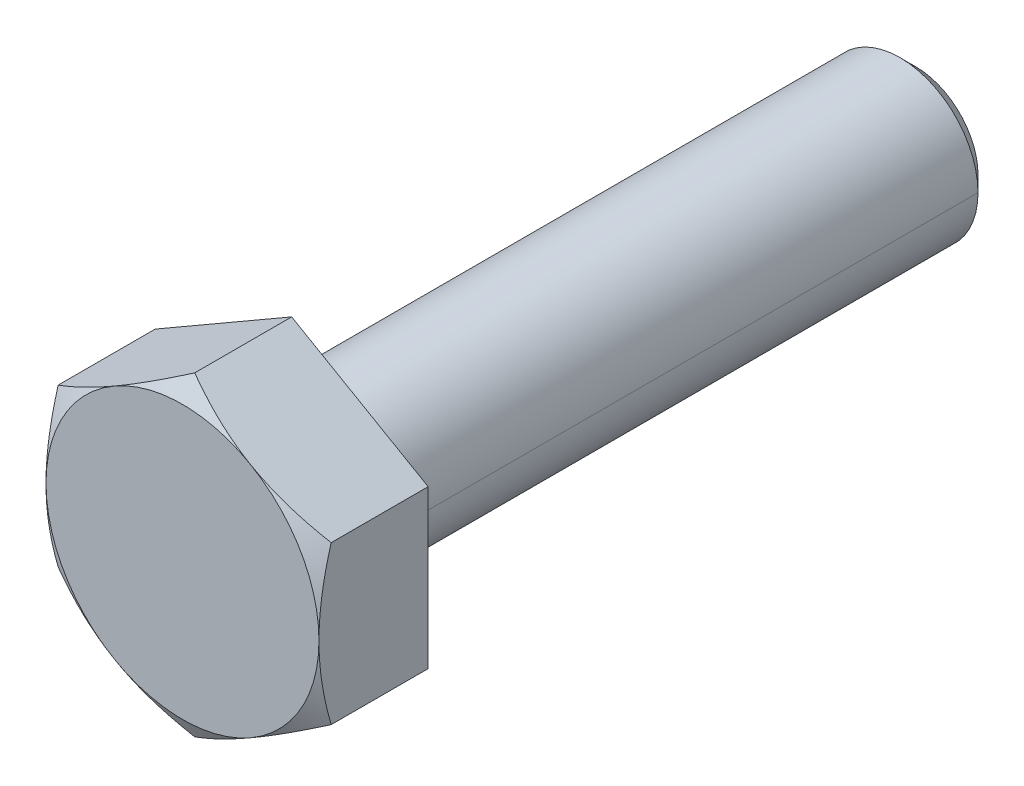
ISO-10303-21;
HEADER;
FILE_DESCRIPTION(('STEP AP214'),'2;1');
FILE_NAME('part.step','',(''),(''),'','','');
FILE_SCHEMA(('AUTOMOTIVE_DESIGN { 1 0 10303 214 1 1 1 1 }'));
ENDSEC;
DATA;
#1=APPLICATION_CONTEXT('core data for automotive mechanical design processes');
#2=APPLICATION_PROTOCOL_DEFINITION('international standard','automotive_design',2000,#1);
#3=PRODUCT_CONTEXT('',#1,'mechanical');
#4=PRODUCT('Part','Part','',(#3));
#5=PRODUCT_RELATED_PRODUCT_CATEGORY('part','',(#4));
#6=PRODUCT_DEFINITION_FORMATION('','',#4);
#7=PRODUCT_DEFINITION_CONTEXT('part definition',#1,'design');
#8=PRODUCT_DEFINITION('design','',#6,#7);
#9=PRODUCT_DEFINITION_SHAPE('','',#8);
#10=(LENGTH_UNIT() NAMED_UNIT(*) SI_UNIT(.MILLI.,.METRE.));
#11=(NAMED_UNIT(*) PLANE_ANGLE_UNIT() SI_UNIT($,.RADIAN.));
#12=(NAMED_UNIT(*) SI_UNIT($,.STERADIAN.) SOLID_ANGLE_UNIT());
#13=UNCERTAINTY_MEASURE_WITH_UNIT(LENGTH_MEASURE(1.E-05),#10,'distance_accuracy_value','');
#14=(GEOMETRIC_REPRESENTATION_CONTEXT(3) GLOBAL_UNCERTAINTY_ASSIGNED_CONTEXT((#13)) GLOBAL_UNIT_ASSIGNED_CONTEXT((#10,
#11,#12)) REPRESENTATION_CONTEXT('',''));
#15=CARTESIAN_POINT('',(0.,0.,0.));
#16=DIRECTION('',(0.,0.,1.));
#17=DIRECTION('',(1.,0.,0.));
#18=AXIS2_PLACEMENT_3D('',#15,#16,#17);
#19=CARTESIAN_POINT('',(-3.5,2.020725942164,16.));
#20=DIRECTION('',(-1.,0.,0.));
#21=DIRECTION('',(0.,0.,1.));
#22=AXIS2_PLACEMENT_3D('',#19,#20,#21);
#23=PLANE('',#22);
#24=DIRECTION('',(0.,0.,1.));
#25=VECTOR('',#24,1.);
#26=CARTESIAN_POINT('',(-3.5,2.020725942164,16.));
#27=LINE('',#26,#25);
#28=CARTESIAN_POINT('',(-3.5,2.020725942164,16.));
#29=VERTEX_POINT('',#28);
#30=CARTESIAN_POINT('',(-3.5,2.020725942164,18.48739260883));
#31=VERTEX_POINT('',#30);
#32=EDGE_CURVE('E153',#29,#31,#27,.T.);
#33=ORIENTED_EDGE('',*,*,#32,.F.);
#34=DIRECTION('',(0.,-1.,0.));
#35=VECTOR('',#34,1.);
#36=CARTESIAN_POINT('',(-3.5,2.020725942164,16.));
#37=LINE('',#36,#35);
#38=CARTESIAN_POINT('',(-3.5,-2.020725942164,16.));
#39=VERTEX_POINT('',#38);
#40=EDGE_CURVE('E161',#29,#39,#37,.T.);
#41=ORIENTED_EDGE('',*,*,#40,.T.);
#42=DIRECTION('',(0.,0.,1.));
#43=VECTOR('',#42,1.);
#44=CARTESIAN_POINT('',(-3.5,-2.020725942164,16.));
#45=LINE('',#44,#43);
#46=CARTESIAN_POINT('',(-3.5,-2.020725942164,18.48739260883));
#47=VERTEX_POINT('',#46);
#48=EDGE_CURVE('E10',#39,#47,#45,.T.);
#49=ORIENTED_EDGE('',*,*,#48,.T.);
#50=CARTESIAN_POINT('',(-3.500000000009,4.25789900067E-10,18.8));
#51=CARTESIAN_POINT('',(-3.500000000009,-0.1320789439768,18.8));
#52=CARTESIAN_POINT('',(-3.499999999996,-0.3964152682255,18.7913266907));
#53=CARTESIAN_POINT('',(-3.500000000001,-0.7925965413691,18.75285875718));
#54=CARTESIAN_POINT('',(-3.5,-1.191030931495,18.68995460997));
#55=CARTESIAN_POINT('',(-3.5,-1.596590700786,18.60321956078));
#56=CARTESIAN_POINT('',(-3.5,-1.877843824249,18.52863912345));
#57=CARTESIAN_POINT('',(-3.5,-2.020725942164,18.48739260883));
#58=(BOUNDED_CURVE() B_SPLINE_CURVE(3,(#50,#51,#52,#53,#54,#55,#56,#57),.UNSPECIFIED.,.F.,
.F.) B_SPLINE_CURVE_WITH_KNOTS((4,1,1,1,1,4),(0.,0.2,0.4,0.6,0.8,1.),
.UNSPECIFIED.) CURVE() GEOMETRIC_REPRESENTATION_ITEM() RATIONAL_B_SPLINE_CURVE((1.,1.,1.,1.,1.,
1.,1.,1.)) REPRESENTATION_ITEM(''));
#59=CARTESIAN_POINT('',(-3.5,5.062208430218E-10,18.8));
#60=VERTEX_POINT('',#59);
#61=EDGE_CURVE('E339',#60,#47,#58,.T.);
#62=ORIENTED_EDGE('',*,*,#61,.F.);
#63=CARTESIAN_POINT('',(-3.50000000000195,2.02072594216512,18.4873926088339));
#64=CARTESIAN_POINT('',(-3.4999950770941,1.93332768022386,18.5126222436285));
#65=CARTESIAN_POINT('',(-3.49997261641851,1.84559665107567,18.536734409787));
#66=CARTESIAN_POINT('',(-3.49992879962255,1.67176895560997,18.5817952310012));
#67=CARTESIAN_POINT('',(-3.49990742997353,1.58568938685856,18.6028100225438));
#68=CARTESIAN_POINT('',(-3.49989817233574,1.41470837964117,18.6416860086028));
#69=CARTESIAN_POINT('',(-3.49990959371178,1.32981993374518,18.6596039479964));
#70=CARTESIAN_POINT('',(-3.49996608706272,1.16070995416585,18.6922870707533));
#71=CARTESIAN_POINT('',(-3.5000106698485,1.07649653762232,18.7070941130184));
#72=CARTESIAN_POINT('',(-3.49998947699124,0.90875542517256,18.7335155474724));
#73=CARTESIAN_POINT('',(-3.4999252116219,0.825234241252092,18.7451710716652));
#74=CARTESIAN_POINT('',(-3.49980657528085,0.659245084609212,18.7651017231374));
#75=CARTESIAN_POINT('',(-3.49975205297055,0.576783745216072,18.7734316099234));
#76=CARTESIAN_POINT('',(-3.49974868937059,0.412168964766069,18.7867199262032));
#77=CARTESIAN_POINT('',(-3.49979911142692,0.330017405465324,18.7917015340359));
#78=CARTESIAN_POINT('',(-3.49991293967768,0.165244439532855,18.7983615908241));
#79=CARTESIAN_POINT('',(-3.49997639808726,0.0826224847184055,18.800026458896));
#80=CARTESIAN_POINT('',(-3.50000000000895,4.25786524887805E-10,18.7999999999999));
#81=B_SPLINE_CURVE_WITH_KNOTS('',3,(#63,#64,#65,#66,#67,#68,#69,#70,#71,#72,#73,#74,#75,#76,#77,
#78,#79,#80),.UNSPECIFIED.,.F.,.F.,(4,2,2,2,2,2,2,2,4),(0.,0.272907810229987,0.538693543815018,
0.798922700095635,1.05538730896622,1.30832253492736,1.55690176920705,1.80374199495418,
2.05159088416012),.UNSPECIFIED.);
#82=EDGE_CURVE('E113',#31,#60,#81,.T.);
#83=ORIENTED_EDGE('',*,*,#82,.F.);
#84=EDGE_LOOP('',(#33,#41,#49,#62,#83));
#85=FACE_BOUND('',#84,.T.);
#86=ADVANCED_FACE('F16',(#85),#23,.T.);
#87=CARTESIAN_POINT('',(-3.5,-2.020725942164,16.));
#88=DIRECTION('',(-0.500000000000017,-0.866025403784429,0.));
#89=DIRECTION('',(-0.866025403784429,0.500000000000017,0.));
#90=AXIS2_PLACEMENT_3D('',#87,#88,#89);
#91=PLANE('',#90);
#92=ORIENTED_EDGE('',*,*,#48,.F.);
#93=DIRECTION('',(0.866025403784429,-0.500000000000017,0.));
#94=VECTOR('',#93,1.);
#95=CARTESIAN_POINT('',(-3.5,-2.020725942164,16.));
#96=LINE('',#95,#94);
#97=CARTESIAN_POINT('',(0.,-4.041451884327,16.));
#98=VERTEX_POINT('',#97);
#99=EDGE_CURVE('E445',#39,#98,#96,.T.);
#100=ORIENTED_EDGE('',*,*,#99,.T.);
#101=DIRECTION('',(0.,0.,1.));
#102=VECTOR('',#101,1.);
#103=CARTESIAN_POINT('',(0.,-4.041451884327,16.));
#104=LINE('',#103,#102);
#105=CARTESIAN_POINT('',(0.,-4.041451884327,18.48739260883));
#106=VERTEX_POINT('',#105);
#107=EDGE_CURVE('E28',#98,#106,#104,.T.);
#108=ORIENTED_EDGE('',*,*,#107,.T.);
#109=CARTESIAN_POINT('',(-1.750000000354,-3.03108891305,18.8));
#110=CARTESIAN_POINT('',(-1.635616279197,-3.097128385251,18.8));
#111=CARTESIAN_POINT('',(-1.406694307275,-3.22929654735,18.7913266907));
#112=CARTESIAN_POINT('',(-1.063591260221,-3.427387183932,18.75285875718));
#113=CARTESIAN_POINT('',(-0.7185369566327,-3.626604378993,18.68995460997));
#114=CARTESIAN_POINT('',(-0.3673118936736,-3.829384263638,18.60321956078));
#115=CARTESIAN_POINT('',(-0.1237395438604,-3.97001082537,18.52863912345));
#116=CARTESIAN_POINT('',(0.,-4.041451884327,18.48739260883));
#117=(BOUNDED_CURVE() B_SPLINE_CURVE(3,(#109,#110,#111,#112,#113,#114,#115,#116),.UNSPECIFIED.,
.F.,.F.) B_SPLINE_CURVE_WITH_KNOTS((4,1,1,1,1,4),(0.,0.2,0.4,0.6,0.8,1.),
.UNSPECIFIED.) CURVE() GEOMETRIC_REPRESENTATION_ITEM() RATIONAL_B_SPLINE_CURVE((1.,1.,1.,1.,1.,
1.,1.,1.)) REPRESENTATION_ITEM(''));
#118=CARTESIAN_POINT('',(-1.750000000365,-3.031088913035,18.8));
#119=VERTEX_POINT('',#118);
#120=EDGE_CURVE('E385',#119,#106,#117,.T.);
#121=ORIENTED_EDGE('',*,*,#120,.F.);
#122=CARTESIAN_POINT('',(-3.50000000000195,-2.02072594216512,18.4873926088339));
#123=CARTESIAN_POINT('',(-3.42430842346483,-2.06442080976978,18.512622243627));
#124=CARTESIAN_POINT('',(-3.34831989318933,-2.10826687282594,18.536734409784));
#125=CARTESIAN_POINT('',(-3.19775878464326,-2.19514277409788,18.5817952309961));
#126=CARTESIAN_POINT('',(-3.12320100653493,-2.23816405181445,18.6028100225381));
#127=CARTESIAN_POINT('',(-2.97512248190145,-2.32364653807463,18.6416860085971));
#128=CARTESIAN_POINT('',(-2.90161264195435,-2.36610065222563,18.659603947991));
#129=CARTESIAN_POINT('',(-2.75518735027438,-2.45070456669481,18.6922870707501));
#130=CARTESIAN_POINT('',(-2.68227868359622,-2.49284988479292,18.7070941130168));
#131=CARTESIAN_POINT('',(-2.53700002252494,-2.57670208746321,18.7335155474725));
#132=CARTESIAN_POINT('',(-2.46463642281382,-2.6184070239779,18.7451710716655));
#133=CARTESIAN_POINT('',(-2.32082627824095,-2.70129886021137,18.765101723138));
#134=CARTESIAN_POINT('',(-2.24938540234154,-2.74248231220242,18.7734316099239));
#135=CARTESIAN_POINT('',(-2.10682313883084,-2.82478678946707,18.7867199262038));
#136=CARTESIAN_POINT('',(-2.03570301254113,-2.86590623590152,18.7917015340365));
#137=CARTESIAN_POINT('',(-1.89306235230266,-2.94839129703088,18.7983615908248));
#138=CARTESIAN_POINT('',(-1.82154136972129,-2.9897572310368,18.8000264588966));
#139=CARTESIAN_POINT('',(-1.75000000035414,-3.03108891305024,18.8000000000005));
#140=B_SPLINE_CURVE_WITH_KNOTS('',3,(#122,#123,#124,#125,#126,#127,#128,#129,#130,#131,#132,
#133,#134,#135,#136,#137,#138,#139),.UNSPECIFIED.,.F.,.F.,(4,2,2,2,2,2,2,2,4),(0.,
0.272907810213471,0.538693543793469,0.798922700079695,1.05538730896552,1.30832253491486,
1.55690176919416,1.80374199495245,2.05159088418115),.UNSPECIFIED.);
#141=EDGE_CURVE('E310',#47,#119,#140,.T.);
#142=ORIENTED_EDGE('',*,*,#141,.F.);
#143=EDGE_LOOP('',(#92,#100,#108,#121,#142));
#144=FACE_BOUND('',#143,.T.);
#145=ADVANCED_FACE('F325',(#144),#91,.T.);
#146=CARTESIAN_POINT('',(0.,-4.041451884327,16.));
#147=DIRECTION('',(0.500000000000017,-0.866025403784429,0.));
#148=DIRECTION('',(0.,0.,-1.));
#149=AXIS2_PLACEMENT_3D('',#146,#147,#148);
#150=PLANE('',#149);
#151=ORIENTED_EDGE('',*,*,#107,.F.);
#152=DIRECTION('',(0.866025403784429,0.500000000000017,0.));
#153=VECTOR('',#152,1.);
#154=CARTESIAN_POINT('',(0.,-4.041451884327,16.));
#155=LINE('',#154,#153);
#156=CARTESIAN_POINT('',(3.5,-2.020725942164,16.));
#157=VERTEX_POINT('',#156);
#158=EDGE_CURVE('E451',#98,#157,#155,.T.);
#159=ORIENTED_EDGE('',*,*,#158,.T.);
#160=DIRECTION('',(0.,0.,1.));
#161=VECTOR('',#160,1.);
#162=CARTESIAN_POINT('',(3.5,-2.020725942164,16.));
#163=LINE('',#162,#161);
#164=CARTESIAN_POINT('',(3.5,-2.020725942164,18.48739260883));
#165=VERTEX_POINT('',#164);
#166=EDGE_CURVE('E210',#157,#165,#163,.T.);
#167=ORIENTED_EDGE('',*,*,#166,.T.);
#168=CARTESIAN_POINT('',(1.749999999733,-3.0310889134,18.8));
#169=CARTESIAN_POINT('',(1.864383720891,-2.965049441199,18.8));
#170=CARTESIAN_POINT('',(2.093305692684,-2.83288127916,18.7913266907));
#171=CARTESIAN_POINT('',(2.43640873979,-2.634790642554,18.75285875718));
#172=CARTESIAN_POINT('',(2.781463043364,-2.4355734475,18.68995460997));
#173=CARTESIAN_POINT('',(3.132688106327,-2.232793562852,18.60321956078));
#174=CARTESIAN_POINT('',(3.37626045614,-2.092167001121,18.52863912345));
#175=CARTESIAN_POINT('',(3.5,-2.020725942164,18.48739260883));
#176=(BOUNDED_CURVE() B_SPLINE_CURVE(3,(#168,#169,#170,#171,#172,#173,#174,#175),.UNSPECIFIED.,
.F.,.F.) B_SPLINE_CURVE_WITH_KNOTS((4,1,1,1,1,4),(0.,0.2,0.4,0.6,0.8,1.),
.UNSPECIFIED.) CURVE() GEOMETRIC_REPRESENTATION_ITEM() RATIONAL_B_SPLINE_CURVE((1.,1.,1.,1.,1.,
1.,1.,1.)) REPRESENTATION_ITEM(''));
#177=CARTESIAN_POINT('',(1.749999999969,-3.031088913263,18.8));
#178=VERTEX_POINT('',#177);
#179=EDGE_CURVE('E392',#178,#165,#176,.T.);
#180=ORIENTED_EDGE('',*,*,#179,.F.);
#181=CARTESIAN_POINT('',(0.,-4.04145188432939,18.4873926088341));
#182=CARTESIAN_POINT('',(0.0756866536308472,-3.99774848999723,18.5126222436278));
#183=CARTESIAN_POINT('',(0.15165272323274,-3.95386352390947,18.5367344097852));
#184=CARTESIAN_POINT('',(0.302170014985909,-3.86691172972112,18.581795230998));
#185=CARTESIAN_POINT('',(0.376706423446282,-3.82385343868741,18.6028100225402));
#186=CARTESIAN_POINT('',(0.524775690442794,-3.73835491772977,18.6416860085992));
#187=CARTESIAN_POINT('',(0.598296951765685,-3.69592058598319,18.6596039479929));
#188=CARTESIAN_POINT('',(0.744778736793729,-3.61141452086784,18.6922870707513));
#189=CARTESIAN_POINT('',(0.817731986255068,-3.56934642241877,18.7070941130174));
#190=CARTESIAN_POINT('',(0.962989454470823,-3.48545751263709,18.7335155474732));
#191=CARTESIAN_POINT('',(1.03528878881699,-3.44364126523276,18.7451710716666));
#192=CARTESIAN_POINT('',(1.17898029706,-3.36054394482131,18.7651017231399));
#193=CARTESIAN_POINT('',(1.25036665065588,-3.31926605741571,18.7734316099261));
#194=CARTESIAN_POINT('',(1.39292555058109,-3.23695575421832,18.7867199262065));
#195=CARTESIAN_POINT('',(1.46409609893483,-3.19592364134348,18.7917015340394));
#196=CARTESIAN_POINT('',(1.60685058743958,-3.11363573651792,18.7983615908279));
#197=CARTESIAN_POINT('',(1.67843502843835,-3.07237971569548,18.8000264588998));
#198=CARTESIAN_POINT('',(1.74999999973406,-3.03108891340184,18.8000000000037));
#199=B_SPLINE_CURVE_WITH_KNOTS('',3,(#181,#182,#183,#184,#185,#186,#187,#188,#189,#190,#191,
#192,#193,#194,#195,#196,#197,#198),.UNSPECIFIED.,.F.,.F.,(4,2,2,2,2,2,2,2,4),(0.,
0.272907810219288,0.538693543801071,0.79892270008534,1.05538730896581,1.30832253493368,
1.55690176923499,1.80374199501891,2.05159088427705),.UNSPECIFIED.);
#200=EDGE_CURVE('E62',#106,#178,#199,.T.);
#201=ORIENTED_EDGE('',*,*,#200,.F.);
#202=EDGE_LOOP('',(#151,#159,#167,#180,#201));
#203=FACE_BOUND('',#202,.T.);
#204=ADVANCED_FACE('F222',(#203),#150,.T.);
#205=CARTESIAN_POINT('',(3.5,-2.020725942164,16.));
#206=DIRECTION('',(1.,0.,0.));
#207=DIRECTION('',(0.,1.,0.));
#208=AXIS2_PLACEMENT_3D('',#205,#206,#207);
#209=PLANE('',#208);
#210=ORIENTED_EDGE('',*,*,#166,.F.);
#211=DIRECTION('',(0.,1.,0.));
#212=VECTOR('',#211,1.);
#213=CARTESIAN_POINT('',(3.5,-2.020725942164,16.));
#214=LINE('',#213,#212);
#215=CARTESIAN_POINT('',(3.5,2.020725942164,16.));
#216=VERTEX_POINT('',#215);
#217=EDGE_CURVE('E462',#157,#216,#214,.T.);
#218=ORIENTED_EDGE('',*,*,#217,.T.);
#219=DIRECTION('',(0.,0.,1.));
#220=VECTOR('',#219,1.);
#221=CARTESIAN_POINT('',(3.5,2.020725942164,16.));
#222=LINE('',#221,#220);
#223=CARTESIAN_POINT('',(3.5,2.020725942164,18.48739260883));
#224=VERTEX_POINT('',#223);
#225=EDGE_CURVE('E252',#216,#224,#222,.T.);
#226=ORIENTED_EDGE('',*,*,#225,.T.);
#227=CARTESIAN_POINT('',(3.500000000009,-4.257888461067E-10,18.8));
#228=CARTESIAN_POINT('',(3.500000000009,0.1320789439768,18.8));
#229=CARTESIAN_POINT('',(3.499999999996,0.3964152682255,18.7913266907));
#230=CARTESIAN_POINT('',(3.500000000001,0.7925965413691,18.75285875718));
#231=CARTESIAN_POINT('',(3.5,1.191030931495,18.68995460997));
#232=CARTESIAN_POINT('',(3.5,1.596590700786,18.60321956078));
#233=CARTESIAN_POINT('',(3.5,1.877843824249,18.52863912345));
#234=CARTESIAN_POINT('',(3.5,2.020725942164,18.48739260883));
#235=(BOUNDED_CURVE() B_SPLINE_CURVE(3,(#227,#228,#229,#230,#231,#232,#233,#234),.UNSPECIFIED.,
.F.,.F.) B_SPLINE_CURVE_WITH_KNOTS((4,1,1,1,1,4),(0.,0.2,0.4,0.6,0.8,1.),
.UNSPECIFIED.) CURVE() GEOMETRIC_REPRESENTATION_ITEM() RATIONAL_B_SPLINE_CURVE((1.,1.,1.,1.,1.,
1.,1.,1.)) REPRESENTATION_ITEM(''));
#236=CARTESIAN_POINT('',(3.5,-5.06223507557E-10,18.8));
#237=VERTEX_POINT('',#236);
#238=EDGE_CURVE('E405',#237,#224,#235,.T.);
#239=ORIENTED_EDGE('',*,*,#238,.F.);
#240=CARTESIAN_POINT('',(3.50000000000194,-2.02072594216514,18.4873926088339));
#241=CARTESIAN_POINT('',(3.49999507709409,-1.93332768022388,18.5126222436285));
#242=CARTESIAN_POINT('',(3.4999726164185,-1.84559665107569,18.536734409787));
#243=CARTESIAN_POINT('',(3.49992879962255,-1.67176895560999,18.5817952310012));
#244=CARTESIAN_POINT('',(3.49990742997352,-1.58568938685857,18.6028100225438));
#245=CARTESIAN_POINT('',(3.49989817233574,-1.41470837964118,18.6416860086028));
#246=CARTESIAN_POINT('',(3.49990959371178,-1.32981993374518,18.6596039479964));
#247=CARTESIAN_POINT('',(3.49996608706272,-1.16070995416584,18.6922870707533));
#248=CARTESIAN_POINT('',(3.50001066984851,-1.07649653762231,18.7070941130184));
#249=CARTESIAN_POINT('',(3.49998947699124,-0.908755425172547,18.7335155474724));
#250=CARTESIAN_POINT('',(3.4999252116219,-0.825234241252079,18.7451710716652));
#251=CARTESIAN_POINT('',(3.49980657528085,-0.659245084609199,18.7651017231374));
#252=CARTESIAN_POINT('',(3.49975205297055,-0.576783745216059,18.7734316099234));
#253=CARTESIAN_POINT('',(3.49974868937059,-0.412168964766057,18.7867199262032));
#254=CARTESIAN_POINT('',(3.49979911142692,-0.330017405465313,18.7917015340359));
#255=CARTESIAN_POINT('',(3.49991293967768,-0.165244439532844,18.7983615908241));
#256=CARTESIAN_POINT('',(3.49997639808726,-0.0826224847183942,18.800026458896));
#257=CARTESIAN_POINT('',(3.50000000000895,-4.25775216075784E-10,18.7999999999999));
#258=B_SPLINE_CURVE_WITH_KNOTS('',3,(#240,#241,#242,#243,#244,#245,#246,#247,#248,#249,#250,
#251,#252,#253,#254,#255,#256,#257),.UNSPECIFIED.,.F.,.F.,(4,2,2,2,2,2,2,2,4),(0.,
0.272907810229994,0.538693543815033,0.798922700095661,1.05538730896626,1.30832253492739,
1.55690176920708,1.80374199495421,2.05159088416015),.UNSPECIFIED.);
#259=EDGE_CURVE('E204',#165,#237,#258,.T.);
#260=ORIENTED_EDGE('',*,*,#259,.F.);
#261=EDGE_LOOP('',(#210,#218,#226,#239,#260));
#262=FACE_BOUND('',#261,.T.);
#263=ADVANCED_FACE('F212',(#262),#209,.T.);
#264=CARTESIAN_POINT('',(3.5,2.020725942164,16.));
#265=DIRECTION('',(0.500000000000017,0.866025403784429,0.));
#266=DIRECTION('',(0.,0.,-1.));
#267=AXIS2_PLACEMENT_3D('',#264,#265,#266);
#268=PLANE('',#267);
#269=ORIENTED_EDGE('',*,*,#225,.F.);
#270=DIRECTION('',(-0.866025403784429,0.500000000000017,0.));
#271=VECTOR('',#270,1.);
#272=CARTESIAN_POINT('',(3.5,2.020725942164,16.));
#273=LINE('',#272,#271);
#274=CARTESIAN_POINT('',(0.,4.041451884327,16.));
#275=VERTEX_POINT('',#274);
#276=EDGE_CURVE('E151',#216,#275,#273,.T.);
#277=ORIENTED_EDGE('',*,*,#276,.T.);
#278=DIRECTION('',(0.,0.,1.));
#279=VECTOR('',#278,1.);
#280=CARTESIAN_POINT('',(0.,4.041451884327,16.));
#281=LINE('',#280,#279);
#282=CARTESIAN_POINT('',(0.,4.041451884327,18.48739260883));
#283=VERTEX_POINT('',#282);
#284=EDGE_CURVE('E140',#275,#283,#281,.T.);
#285=ORIENTED_EDGE('',*,*,#284,.T.);
#286=CARTESIAN_POINT('',(1.750000000354,3.03108891305,18.8));
#287=CARTESIAN_POINT('',(1.635616279197,3.097128385251,18.8));
#288=CARTESIAN_POINT('',(1.406694307275,3.22929654735,18.7913266907));
#289=CARTESIAN_POINT('',(1.063591260221,3.427387183932,18.75285875718));
#290=CARTESIAN_POINT('',(0.7185369566327,3.626604378993,18.68995460997));
#291=CARTESIAN_POINT('',(0.3673118936736,3.829384263638,18.60321956078));
#292=CARTESIAN_POINT('',(0.1237395438604,3.97001082537,18.52863912345));
#293=CARTESIAN_POINT('',(0.,4.041451884327,18.48739260883));
#294=(BOUNDED_CURVE() B_SPLINE_CURVE(3,(#286,#287,#288,#289,#290,#291,#292,#293),.UNSPECIFIED.,
.F.,.F.) B_SPLINE_CURVE_WITH_KNOTS((4,1,1,1,1,4),(0.,0.2,0.4,0.6,0.8,1.),
.UNSPECIFIED.) CURVE() GEOMETRIC_REPRESENTATION_ITEM() RATIONAL_B_SPLINE_CURVE((1.,1.,1.,1.,1.,
1.,1.,1.)) REPRESENTATION_ITEM(''));
#295=CARTESIAN_POINT('',(1.750000000365,3.031088913035,18.8));
#296=VERTEX_POINT('',#295);
#297=EDGE_CURVE('E123',#296,#283,#294,.T.);
#298=ORIENTED_EDGE('',*,*,#297,.F.);
#299=CARTESIAN_POINT('',(3.50000000000195,2.02072594216512,18.4873926088339));
#300=CARTESIAN_POINT('',(3.4243084234651,2.06442080976963,18.5126222436269));
#301=CARTESIAN_POINT('',(3.34831989318988,2.10826687282566,18.5367344097838));
#302=CARTESIAN_POINT('',(3.19775878464419,2.19514277409746,18.5817952309958));
#303=CARTESIAN_POINT('',(3.12320100653595,2.23816405181403,18.6028100225378));
#304=CARTESIAN_POINT('',(2.97512248190247,2.32364653807427,18.6416860085967));
#305=CARTESIAN_POINT('',(2.90161264195527,2.36610065222535,18.6596039479907));
#306=CARTESIAN_POINT('',(2.75518735027488,2.45070456669467,18.6922870707499));
#307=CARTESIAN_POINT('',(2.6822786835964,2.49284988479285,18.7070941130167));
#308=CARTESIAN_POINT('',(2.53700002252508,2.57670208746296,18.7335155474725));
#309=CARTESIAN_POINT('',(2.46463642281424,2.61840702397739,18.7451710716655));
#310=CARTESIAN_POINT('',(2.32082627824178,2.70129886021055,18.765101723138));
#311=CARTESIAN_POINT('',(2.2493854023425,2.74248231220156,18.7734316099239));
#312=CARTESIAN_POINT('',(2.10682313883186,2.82478678946627,18.7867199262038));
#313=CARTESIAN_POINT('',(2.03570301254208,2.86590623590083,18.7917015340365));
#314=CARTESIAN_POINT('',(1.89306235230325,2.9483912970305,18.7983615908248));
#315=CARTESIAN_POINT('',(1.8215413697216,2.98975723103662,18.8000264588966));
#316=CARTESIAN_POINT('',(1.75000000035415,3.03108891305024,18.8000000000005));
#317=B_SPLINE_CURVE_WITH_KNOTS('',3,(#299,#300,#301,#302,#303,#304,#305,#306,#307,#308,#309,
#310,#311,#312,#313,#314,#315,#316),.UNSPECIFIED.,.F.,.F.,(4,2,2,2,2,2,2,2,4),(0.,
0.2729078102125,0.53869354379223,0.798922700078841,1.05538730896565,1.30832253491387,
1.55690176919278,1.80374199495139,2.05159088418115),.UNSPECIFIED.);
#318=EDGE_CURVE('E79',#224,#296,#317,.T.);
#319=ORIENTED_EDGE('',*,*,#318,.F.);
#320=EDGE_LOOP('',(#269,#277,#285,#298,#319));
#321=FACE_BOUND('',#320,.T.);
#322=ADVANCED_FACE('F149',(#321),#268,.T.);
#323=CARTESIAN_POINT('',(0.,0.,18.64369630442));
#324=DIRECTION('',(0.,0.,-1.));
#325=DIRECTION('',(0.,-1.,0.));
#326=AXIS2_PLACEMENT_3D('',#323,#324,#325);
#327=CONICAL_SURFACE('',#326,3.770725942164,1.0471975511964);
#328=ORIENTED_EDGE('',*,*,#120,.T.);
#329=ORIENTED_EDGE('',*,*,#200,.T.);
#330=CARTESIAN_POINT('',(0.,0.,18.8));
#331=DIRECTION('',(0.,0.,1.));
#332=DIRECTION('',(-0.500000000104309,-0.866025403724216,0.));
#333=AXIS2_PLACEMENT_3D('',#330,#331,#332);
#334=CIRCLE('',#333,3.5);
#335=EDGE_CURVE('E352',#119,#178,#334,.T.);
#336=ORIENTED_EDGE('',*,*,#335,.F.);
#337=EDGE_LOOP('',(#328,#329,#336));
#338=FACE_BOUND('',#337,.T.);
#339=ADVANCED_FACE('F176',(#338),#327,.T.);
#340=CARTESIAN_POINT('',(0.,0.,18.64369630442));
#341=DIRECTION('',(0.,0.,-1.));
#342=DIRECTION('',(0.,-1.,0.));
#343=AXIS2_PLACEMENT_3D('',#340,#341,#342);
#344=CONICAL_SURFACE('',#343,3.770725942164,1.0471975511964);
#345=ORIENTED_EDGE('',*,*,#61,.T.);
#346=ORIENTED_EDGE('',*,*,#141,.T.);
#347=CARTESIAN_POINT('',(0.,0.,18.8));
#348=DIRECTION('',(0.,0.,1.));
#349=DIRECTION('',(-1.,1.446344461455E-10,0.));
#350=AXIS2_PLACEMENT_3D('',#347,#348,#349);
#351=CIRCLE('',#350,3.5);
#352=EDGE_CURVE('E345',#60,#119,#351,.T.);
#353=ORIENTED_EDGE('',*,*,#352,.F.);
#354=EDGE_LOOP('',(#345,#346,#353));
#355=FACE_BOUND('',#354,.T.);
#356=ADVANCED_FACE('F316',(#355),#344,.T.);
#357=CARTESIAN_POINT('',(0.,0.,18.64369630442));
#358=DIRECTION('',(0.,0.,-1.));
#359=DIRECTION('',(0.,-1.,0.));
#360=AXIS2_PLACEMENT_3D('',#357,#358,#359);
#361=CONICAL_SURFACE('',#360,3.770725942164,1.0471975511964);
#362=CARTESIAN_POINT('',(-1.749999999733,3.0310889134,18.8));
#363=CARTESIAN_POINT('',(-1.864383720891,2.965049441199,18.8));
#364=CARTESIAN_POINT('',(-2.093305692684,2.83288127916,18.7913266907));
#365=CARTESIAN_POINT('',(-2.43640873979,2.634790642554,18.75285875718));
#366=CARTESIAN_POINT('',(-2.781463043364,2.4355734475,18.68995460997));
#367=CARTESIAN_POINT('',(-3.132688106327,2.232793562852,18.60321956078));
#368=CARTESIAN_POINT('',(-3.37626045614,2.092167001121,18.52863912345));
#369=CARTESIAN_POINT('',(-3.5,2.020725942164,18.48739260883));
#370=(BOUNDED_CURVE() B_SPLINE_CURVE(3,(#362,#363,#364,#365,#366,#367,#368,#369),.UNSPECIFIED.,
.F.,.F.) B_SPLINE_CURVE_WITH_KNOTS((4,1,1,1,1,4),(0.,0.2,0.4,0.6,0.8,1.),
.UNSPECIFIED.) CURVE() GEOMETRIC_REPRESENTATION_ITEM() RATIONAL_B_SPLINE_CURVE((1.,1.,1.,1.,1.,
1.,1.,1.)) REPRESENTATION_ITEM(''));
#371=CARTESIAN_POINT('',(-1.749999999969,3.031088913263,18.8));
#372=VERTEX_POINT('',#371);
#373=EDGE_CURVE('E143',#372,#31,#370,.T.);
#374=ORIENTED_EDGE('',*,*,#373,.T.);
#375=ORIENTED_EDGE('',*,*,#82,.T.);
#376=CARTESIAN_POINT('',(0.,0.,18.8));
#377=DIRECTION('',(0.,0.,1.));
#378=DIRECTION('',(-0.49999999999109,0.866025403789583,0.));
#379=AXIS2_PLACEMENT_3D('',#376,#377,#378);
#380=CIRCLE('',#379,3.5);
#381=EDGE_CURVE('E296',#372,#60,#380,.T.);
#382=ORIENTED_EDGE('',*,*,#381,.F.);
#383=EDGE_LOOP('',(#374,#375,#382));
#384=FACE_BOUND('',#383,.T.);
#385=ADVANCED_FACE('F184',(#384),#361,.T.);
#386=CARTESIAN_POINT('',(0.,0.,18.64369630442));
#387=DIRECTION('',(0.,0.,-1.));
#388=DIRECTION('',(0.,-1.,0.));
#389=AXIS2_PLACEMENT_3D('',#386,#387,#388);
#390=CONICAL_SURFACE('',#389,3.770725942164,1.0471975511964);
#391=ORIENTED_EDGE('',*,*,#179,.T.);
#392=ORIENTED_EDGE('',*,*,#259,.T.);
#393=CARTESIAN_POINT('',(0.,0.,18.8));
#394=DIRECTION('',(0.,0.,1.));
#395=DIRECTION('',(0.49999999999109,-0.866025403789583,0.));
#396=AXIS2_PLACEMENT_3D('',#393,#394,#395);
#397=CIRCLE('',#396,3.5);
#398=EDGE_CURVE('E265',#178,#237,#397,.T.);
#399=ORIENTED_EDGE('',*,*,#398,.F.);
#400=EDGE_LOOP('',(#391,#392,#399));
#401=FACE_BOUND('',#400,.T.);
#402=ADVANCED_FACE('F179',(#401),#390,.T.);
#403=CARTESIAN_POINT('',(0.,0.,18.64369630442));
#404=DIRECTION('',(0.,0.,-1.));
#405=DIRECTION('',(0.,-1.,0.));
#406=AXIS2_PLACEMENT_3D('',#403,#404,#405);
#407=CONICAL_SURFACE('',#406,3.770725942164,1.0471975511964);
#408=ORIENTED_EDGE('',*,*,#238,.T.);
#409=ORIENTED_EDGE('',*,*,#318,.T.);
#410=CARTESIAN_POINT('',(0.,0.,18.8));
#411=DIRECTION('',(0.,0.,1.));
#412=DIRECTION('',(1.,-1.44635502622E-10,0.));
#413=AXIS2_PLACEMENT_3D('',#410,#411,#412);
#414=CIRCLE('',#413,3.5);
#415=EDGE_CURVE('E288',#237,#296,#414,.T.);
#416=ORIENTED_EDGE('',*,*,#415,.F.);
#417=EDGE_LOOP('',(#408,#409,#416));
#418=FACE_BOUND('',#417,.T.);
#419=ADVANCED_FACE('F183',(#418),#407,.T.);
#420=CARTESIAN_POINT('',(0.,0.,18.8));
#421=DIRECTION('',(0.,0.,1.));
#422=DIRECTION('',(1.,0.,0.));
#423=AXIS2_PLACEMENT_3D('',#420,#421,#422);
#424=PLANE('',#423);
#425=ORIENTED_EDGE('',*,*,#398,.T.);
#426=ORIENTED_EDGE('',*,*,#415,.T.);
#427=CARTESIAN_POINT('',(0.,0.,18.8));
#428=DIRECTION('',(0.,0.,1.));
#429=DIRECTION('',(0.500000000104309,0.866025403724216,0.));
#430=AXIS2_PLACEMENT_3D('',#427,#428,#429);
#431=CIRCLE('',#430,3.5);
#432=EDGE_CURVE('E129',#296,#372,#431,.T.);
#433=ORIENTED_EDGE('',*,*,#432,.T.);
#434=ORIENTED_EDGE('',*,*,#381,.T.);
#435=ORIENTED_EDGE('',*,*,#352,.T.);
#436=ORIENTED_EDGE('',*,*,#335,.T.);
#437=EDGE_LOOP('',(#425,#426,#433,#434,#435,#436));
#438=FACE_BOUND('',#437,.T.);
#439=ADVANCED_FACE('F186',(#438),#424,.T.);
#440=CARTESIAN_POINT('',(0.,0.,18.64369630442));
#441=DIRECTION('',(0.,0.,-1.));
#442=DIRECTION('',(0.,-1.,0.));
#443=AXIS2_PLACEMENT_3D('',#440,#441,#442);
#444=CONICAL_SURFACE('',#443,3.770725942164,1.0471975511964);
#445=ORIENTED_EDGE('',*,*,#297,.T.);
#446=CARTESIAN_POINT('',(0.,4.04145188432939,18.4873926088341));
#447=CARTESIAN_POINT('',(-0.0756866536298837,3.9977484899978,18.5126222436274));
#448=CARTESIAN_POINT('',(-0.151652723230858,3.95386352391069,18.5367344097845));
#449=CARTESIAN_POINT('',(-0.302170014982894,3.8669117297233,18.5817952309969));
#450=CARTESIAN_POINT('',(-0.376706423443059,3.82385343868989,18.602810022539));
#451=CARTESIAN_POINT('',(-0.524775690439741,3.7383549177324,18.6416860085979));
#452=CARTESIAN_POINT('',(-0.598296951763016,3.69592058598569,18.6596039479918));
#453=CARTESIAN_POINT('',(-0.744778736792202,3.61141452086941,18.6922870707506));
#454=CARTESIAN_POINT('',(-0.817731986254305,3.56934642241955,18.7070941130171));
#455=CARTESIAN_POINT('',(-0.962989454469731,3.48545751263738,18.7335155474732));
#456=CARTESIAN_POINT('',(-1.0352887888148,3.44364126523335,18.7451710716666));
#457=CARTESIAN_POINT('',(-1.17898029705642,3.36054394482244,18.7651017231399));
#458=CARTESIAN_POINT('',(-1.25036665065203,3.31926605741709,18.7734316099261));
#459=CARTESIAN_POINT('',(-1.39292555057736,3.23695575421989,18.7867199262065));
#460=CARTESIAN_POINT('',(-1.46409609893149,3.195923641345,18.7917015340394));
#461=CARTESIAN_POINT('',(-1.60685058743764,3.11363573651892,18.798361590828));
#462=CARTESIAN_POINT('',(-1.6784350284374,3.07237971569601,18.8000264588998));
#463=CARTESIAN_POINT('',(-1.74999999973407,3.03108891340184,18.8000000000037));
#464=B_SPLINE_CURVE_WITH_KNOTS('',3,(#446,#447,#448,#449,#450,#451,#452,#453,#454,#455,#456,
#457,#458,#459,#460,#461,#462,#463),.UNSPECIFIED.,.F.,.F.,(4,2,2,2,2,2,2,2,4),(0.,
0.272907810215769,0.538693543796501,0.798922700082008,1.05538730896579,1.30832253493038,
1.5569017692306,1.80374199501563,2.05159088427706),.UNSPECIFIED.);
#465=EDGE_CURVE('E125',#283,#372,#464,.T.);
#466=ORIENTED_EDGE('',*,*,#465,.T.);
#467=ORIENTED_EDGE('',*,*,#432,.F.);
#468=EDGE_LOOP('',(#445,#466,#467));
#469=FACE_BOUND('',#468,.T.);
#470=ADVANCED_FACE('F18',(#469),#444,.T.);
#471=CARTESIAN_POINT('',(0.,4.041451884327,16.));
#472=DIRECTION('',(-0.500000000000017,0.866025403784429,0.));
#473=DIRECTION('',(0.,0.,1.));
#474=AXIS2_PLACEMENT_3D('',#471,#472,#473);
#475=PLANE('',#474);
#476=ORIENTED_EDGE('',*,*,#284,.F.);
#477=DIRECTION('',(-0.866025403784429,-0.500000000000017,0.));
#478=VECTOR('',#477,1.);
#479=CARTESIAN_POINT('',(0.,4.041451884327,16.));
#480=LINE('',#479,#478);
#481=EDGE_CURVE('E154',#275,#29,#480,.T.);
#482=ORIENTED_EDGE('',*,*,#481,.T.);
#483=ORIENTED_EDGE('',*,*,#32,.T.);
#484=ORIENTED_EDGE('',*,*,#373,.F.);
#485=ORIENTED_EDGE('',*,*,#465,.F.);
#486=EDGE_LOOP('',(#476,#482,#483,#484,#485));
#487=FACE_BOUND('',#486,.T.);
#488=ADVANCED_FACE('F137',(#487),#475,.T.);
#489=CARTESIAN_POINT('',(0.,0.,16.));
#490=DIRECTION('',(0.,0.,1.));
#491=DIRECTION('',(1.,0.,0.));
#492=AXIS2_PLACEMENT_3D('',#489,#490,#491);
#493=PLANE('',#492);
#494=CARTESIAN_POINT('',(0.,0.,16.));
#495=DIRECTION('',(0.,0.,1.));
#496=DIRECTION('',(-1.,0.,0.));
#497=AXIS2_PLACEMENT_3D('',#494,#495,#496);
#498=CIRCLE('',#497,2.);
#499=CARTESIAN_POINT('',(-2.,0.,16.));
#500=VERTEX_POINT('',#499);
#501=CARTESIAN_POINT('',(2.,0.,16.));
#502=VERTEX_POINT('',#501);
#503=EDGE_CURVE('E457',#500,#502,#498,.T.);
#504=ORIENTED_EDGE('',*,*,#503,.T.);
#505=CARTESIAN_POINT('',(0.,0.,16.));
#506=DIRECTION('',(0.,0.,1.));
#507=DIRECTION('',(1.,0.,0.));
#508=AXIS2_PLACEMENT_3D('',#505,#506,#507);
#509=CIRCLE('',#508,2.);
#510=EDGE_CURVE('E478',#502,#500,#509,.T.);
#511=ORIENTED_EDGE('',*,*,#510,.T.);
#512=EDGE_LOOP('',(#504,#511));
#513=FACE_BOUND('',#512,.T.);
#514=ORIENTED_EDGE('',*,*,#276,.F.);
#515=ORIENTED_EDGE('',*,*,#217,.F.);
#516=ORIENTED_EDGE('',*,*,#158,.F.);
#517=ORIENTED_EDGE('',*,*,#99,.F.);
#518=ORIENTED_EDGE('',*,*,#40,.F.);
#519=ORIENTED_EDGE('',*,*,#481,.F.);
#520=EDGE_LOOP('',(#514,#515,#516,#517,#518,#519));
#521=FACE_BOUND('',#520,.T.);
#522=ADVANCED_FACE('F175',(#513,#521),#493,.F.);
#523=CARTESIAN_POINT('',(0.,0.,0.));
#524=DIRECTION('',(0.,0.,1.));
#525=DIRECTION('',(1.,0.,0.));
#526=AXIS2_PLACEMENT_3D('',#523,#524,#525);
#527=CYLINDRICAL_SURFACE('',#526,2.);
#528=DIRECTION('',(-1.55297656233898E-07,1.52687277759198E-11,0.999999999999988));
#529=VECTOR('',#528,1.);
#530=CARTESIAN_POINT('',(-1.999997577357,-2.381918713876E-10,0.4000024224279));
#531=LINE('',#530,#529);
#532=CARTESIAN_POINT('',(-2.,0.,0.400001238385));
#533=VERTEX_POINT('',#532);
#534=EDGE_CURVE('E460',#533,#500,#531,.T.);
#535=ORIENTED_EDGE('',*,*,#534,.T.);
#536=ORIENTED_EDGE('',*,*,#510,.F.);
#537=DIRECTION('',(1.55297656233898E-07,-1.52687380842798E-11,0.999999999999988));
#538=VECTOR('',#537,1.);
#539=CARTESIAN_POINT('',(1.999997577357,2.381920321979E-10,0.4000024224279));
#540=LINE('',#539,#538);
#541=CARTESIAN_POINT('',(2.,0.,0.400001238385));
#542=VERTEX_POINT('',#541);
#543=EDGE_CURVE('E461',#542,#502,#540,.T.);
#544=ORIENTED_EDGE('',*,*,#543,.F.);
#545=CARTESIAN_POINT('',(0.,0.,0.400001238385));
#546=DIRECTION('',(0.,0.,-1.));
#547=DIRECTION('',(-1.,0.,0.));
#548=AXIS2_PLACEMENT_3D('',#545,#546,#547);
#549=CIRCLE('',#548,2.);
#550=EDGE_CURVE('E487',#533,#542,#549,.T.);
#551=ORIENTED_EDGE('',*,*,#550,.F.);
#552=EDGE_LOOP('',(#535,#536,#544,#551));
#553=FACE_BOUND('',#552,.T.);
#554=ADVANCED_FACE('F233',(#553),#527,.T.);
#555=CARTESIAN_POINT('',(0.,0.,0.));
#556=DIRECTION('',(0.,0.,1.));
#557=DIRECTION('',(1.,0.,0.));
#558=AXIS2_PLACEMENT_3D('',#555,#556,#557);
#559=CYLINDRICAL_SURFACE('',#558,2.);
#560=ORIENTED_EDGE('',*,*,#543,.T.);
#561=ORIENTED_EDGE('',*,*,#503,.F.);
#562=ORIENTED_EDGE('',*,*,#534,.F.);
#563=CARTESIAN_POINT('',(0.,0.,0.400001238385));
#564=DIRECTION('',(0.,0.,-1.));
#565=DIRECTION('',(1.,0.,0.));
#566=AXIS2_PLACEMENT_3D('',#563,#564,#565);
#567=CIRCLE('',#566,2.);
#568=EDGE_CURVE('E501',#542,#533,#567,.T.);
#569=ORIENTED_EDGE('',*,*,#568,.F.);
#570=EDGE_LOOP('',(#560,#561,#562,#569));
#571=FACE_BOUND('',#570,.T.);
#572=ADVANCED_FACE('F237',(#571),#559,.T.);
#573=CARTESIAN_POINT('',(0.,0.,0.2000049428653));
#574=DIRECTION('',(0.,0.,1.));
#575=DIRECTION('',(0.,-1.,0.));
#576=AXIS2_PLACEMENT_3D('',#573,#574,#575);
#577=CONICAL_SURFACE('',#576,1.799996221735,0.785395740861798);
#578=DIRECTION('',(0.70710706668504,-2.80716250847316E-11,0.70710649568794));
#579=VECTOR('',#578,1.);
#580=CARTESIAN_POINT('',(1.599997415847,2.540717413633E-10,2.583923063811E-06));
#581=LINE('',#580,#579);
#582=CARTESIAN_POINT('',(1.599995635999,0.,3.388110521696E-06));
#583=VERTEX_POINT('',#582);
#584=EDGE_CURVE('E455',#583,#542,#581,.T.);
#585=ORIENTED_EDGE('',*,*,#584,.T.);
#586=ORIENTED_EDGE('',*,*,#568,.T.);
#587=DIRECTION('',(-0.70710706668504,2.80714275482916E-11,0.70710649568794));
#588=VECTOR('',#587,1.);
#589=CARTESIAN_POINT('',(-1.599997415847,-2.540714688094E-10,2.583923063589E-06));
#590=LINE('',#589,#588);
#591=CARTESIAN_POINT('',(-1.599995635999,0.,3.388110521696E-06));
#592=VERTEX_POINT('',#591);
#593=EDGE_CURVE('E485',#592,#533,#590,.T.);
#594=ORIENTED_EDGE('',*,*,#593,.F.);
#595=CARTESIAN_POINT('',(0.,0.,3.38811052103E-06));
#596=DIRECTION('',(0.,0.,-1.));
#597=DIRECTION('',(1.,0.,0.));
#598=AXIS2_PLACEMENT_3D('',#595,#596,#597);
#599=CIRCLE('',#598,1.599995635999);
#600=EDGE_CURVE('E490',#583,#592,#599,.T.);
#601=ORIENTED_EDGE('',*,*,#600,.F.);
#602=EDGE_LOOP('',(#585,#586,#594,#601));
#603=FACE_BOUND('',#602,.T.);
#604=ADVANCED_FACE('F229',(#603),#577,.T.);
#605=CARTESIAN_POINT('',(0.,0.,0.2000049428653));
#606=DIRECTION('',(0.,0.,1.));
#607=DIRECTION('',(0.,-1.,0.));
#608=AXIS2_PLACEMENT_3D('',#605,#606,#607);
#609=CONICAL_SURFACE('',#608,1.799996221735,0.785395740861798);
#610=ORIENTED_EDGE('',*,*,#593,.T.);
#611=ORIENTED_EDGE('',*,*,#550,.T.);
#612=ORIENTED_EDGE('',*,*,#584,.F.);
#613=CARTESIAN_POINT('',(0.,0.,3.388110521696E-06));
#614=DIRECTION('',(0.,0.,-1.));
#615=DIRECTION('',(-1.,0.,0.));
#616=AXIS2_PLACEMENT_3D('',#613,#614,#615);
#617=CIRCLE('',#616,1.599995635999);
#618=EDGE_CURVE('E488',#592,#583,#617,.T.);
#619=ORIENTED_EDGE('',*,*,#618,.F.);
#620=EDGE_LOOP('',(#610,#611,#612,#619));
#621=FACE_BOUND('',#620,.T.);
#622=ADVANCED_FACE('F225',(#621),#609,.T.);
#623=CARTESIAN_POINT('',(0.,0.,0.));
#624=DIRECTION('',(0.,0.,1.));
#625=DIRECTION('',(1.,0.,0.));
#626=AXIS2_PLACEMENT_3D('',#623,#624,#625);
#627=PLANE('',#626);
#628=ORIENTED_EDGE('',*,*,#600,.T.);
#629=ORIENTED_EDGE('',*,*,#618,.T.);
#630=EDGE_LOOP('',(#628,#629));
#631=FACE_BOUND('',#630,.T.);
#632=ADVANCED_FACE('F228',(#631),#627,.F.);
#633=CLOSED_SHELL('',(#86,#145,#204,#263,#322,#339,#356,#385,#402,#419,#439,#470,#488,#522,#554,
#572,#604,#622,#632));
#634=MANIFOLD_SOLID_BREP('B1',#633);
#635=ADVANCED_BREP_SHAPE_REPRESENTATION('',(#18,#634),#14);
#636=SHAPE_DEFINITION_REPRESENTATION(#9,#635);
ENDSEC;
END-ISO-10303-21;
